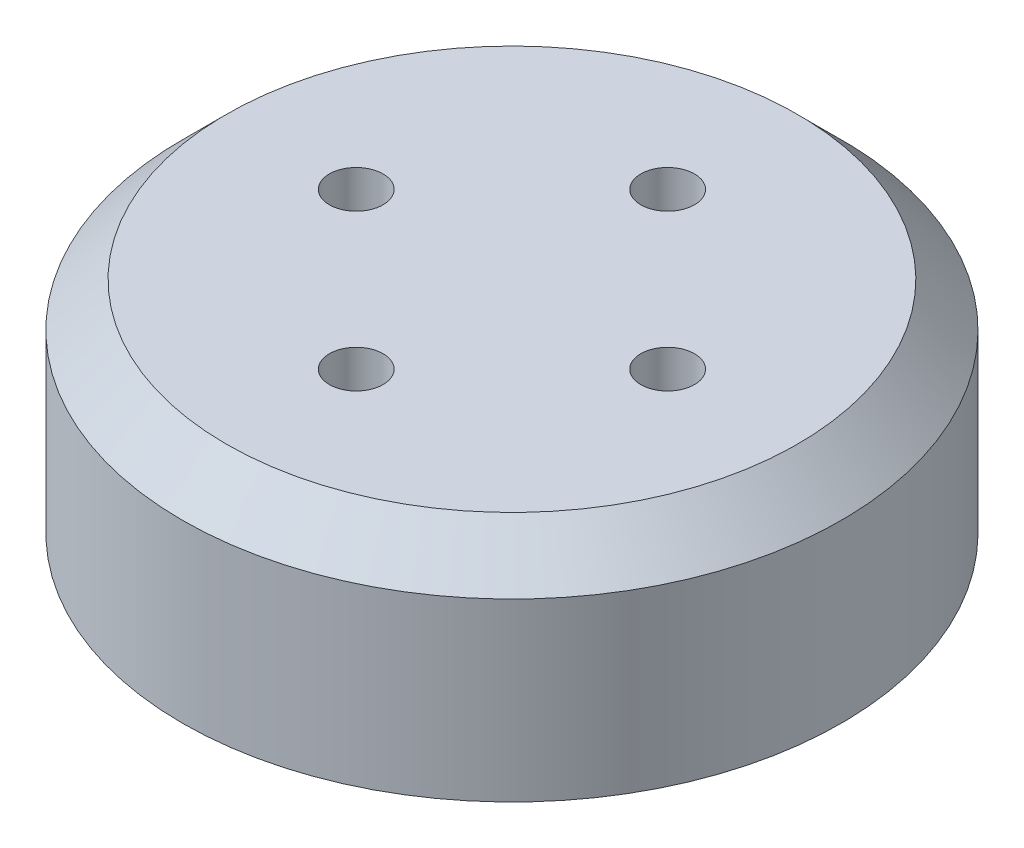
ISO-10303-21;
HEADER;
FILE_DESCRIPTION(('STEP AP214'),'2;1');
FILE_NAME('part.step','',(''),(''),'','','');
FILE_SCHEMA(('AUTOMOTIVE_DESIGN { 1 0 10303 214 1 1 1 1 }'));
ENDSEC;
DATA;
#1=APPLICATION_CONTEXT('core data for automotive mechanical design processes');
#2=APPLICATION_PROTOCOL_DEFINITION('international standard','automotive_design',2000,#1);
#3=PRODUCT_CONTEXT('',#1,'mechanical');
#4=PRODUCT('Part','Part','',(#3));
#5=PRODUCT_RELATED_PRODUCT_CATEGORY('part','',(#4));
#6=PRODUCT_DEFINITION_FORMATION('','',#4);
#7=PRODUCT_DEFINITION_CONTEXT('part definition',#1,'design');
#8=PRODUCT_DEFINITION('design','',#6,#7);
#9=PRODUCT_DEFINITION_SHAPE('','',#8);
#10=(LENGTH_UNIT() NAMED_UNIT(*) SI_UNIT(.MILLI.,.METRE.));
#11=(NAMED_UNIT(*) PLANE_ANGLE_UNIT() SI_UNIT($,.RADIAN.));
#12=(NAMED_UNIT(*) SI_UNIT($,.STERADIAN.) SOLID_ANGLE_UNIT());
#13=UNCERTAINTY_MEASURE_WITH_UNIT(LENGTH_MEASURE(1.E-05),#10,'distance_accuracy_value','');
#14=(GEOMETRIC_REPRESENTATION_CONTEXT(3) GLOBAL_UNCERTAINTY_ASSIGNED_CONTEXT((#13)) GLOBAL_UNIT_ASSIGNED_CONTEXT((#10,
#11,#12)) REPRESENTATION_CONTEXT('',''));
#15=CARTESIAN_POINT('',(0.,0.,0.));
#16=DIRECTION('',(0.,0.,1.));
#17=DIRECTION('',(1.,0.,0.));
#18=AXIS2_PLACEMENT_3D('',#15,#16,#17);
#19=CARTESIAN_POINT('',(0.,12.7,19.05));
#20=DIRECTION('',(0.,1.,0.));
#21=DIRECTION('',(0.,0.,1.));
#22=AXIS2_PLACEMENT_3D('',#19,#20,#21);
#23=PLANE('',#22);
#24=CARTESIAN_POINT('',(0.,12.7,0.));
#25=DIRECTION('',(0.,1.,0.));
#26=DIRECTION('',(0.,0.,1.));
#27=AXIS2_PLACEMENT_3D('',#24,#25,#26);
#28=CIRCLE('',#27,16.51);
#29=CARTESIAN_POINT('',(0.,12.7,16.51));
#30=VERTEX_POINT('',#29);
#31=EDGE_CURVE('E51',#30,#30,#28,.T.);
#32=ORIENTED_EDGE('',*,*,#31,.T.);
#33=EDGE_LOOP('',(#32));
#34=FACE_BOUND('',#33,.T.);
#35=CARTESIAN_POINT('',(0.,12.7,-9.));
#36=DIRECTION('',(0.,1.,0.));
#37=DIRECTION('',(0.,0.,1.));
#38=AXIS2_PLACEMENT_3D('',#35,#36,#37);
#39=CIRCLE('',#38,1.55);
#40=CARTESIAN_POINT('',(0.,12.7,-7.45));
#41=VERTEX_POINT('',#40);
#42=EDGE_CURVE('E74',#41,#41,#39,.T.);
#43=ORIENTED_EDGE('',*,*,#42,.F.);
#44=EDGE_LOOP('',(#43));
#45=FACE_BOUND('',#44,.T.);
#46=CARTESIAN_POINT('',(0.,12.7,9.));
#47=DIRECTION('',(0.,1.,0.));
#48=DIRECTION('',(0.,0.,1.));
#49=AXIS2_PLACEMENT_3D('',#46,#47,#48);
#50=CIRCLE('',#49,1.55);
#51=CARTESIAN_POINT('',(0.,12.7,10.55));
#52=VERTEX_POINT('',#51);
#53=EDGE_CURVE('E87',#52,#52,#50,.T.);
#54=ORIENTED_EDGE('',*,*,#53,.F.);
#55=EDGE_LOOP('',(#54));
#56=FACE_BOUND('',#55,.T.);
#57=CARTESIAN_POINT('',(9.,12.7,0.));
#58=DIRECTION('',(0.,1.,0.));
#59=DIRECTION('',(0.,0.,1.));
#60=AXIS2_PLACEMENT_3D('',#57,#58,#59);
#61=CIRCLE('',#60,1.55);
#62=CARTESIAN_POINT('',(9.,12.7,1.55));
#63=VERTEX_POINT('',#62);
#64=EDGE_CURVE('E83',#63,#63,#61,.T.);
#65=ORIENTED_EDGE('',*,*,#64,.F.);
#66=EDGE_LOOP('',(#65));
#67=FACE_BOUND('',#66,.T.);
#68=CARTESIAN_POINT('',(-9.,12.7,0.));
#69=DIRECTION('',(0.,1.,0.));
#70=DIRECTION('',(0.,0.,1.));
#71=AXIS2_PLACEMENT_3D('',#68,#69,#70);
#72=CIRCLE('',#71,1.55);
#73=CARTESIAN_POINT('',(-9.,12.7,1.55));
#74=VERTEX_POINT('',#73);
#75=EDGE_CURVE('E80',#74,#74,#72,.T.);
#76=ORIENTED_EDGE('',*,*,#75,.F.);
#77=EDGE_LOOP('',(#76));
#78=FACE_BOUND('',#77,.T.);
#79=ADVANCED_FACE('F43',(#34,#45,#56,#67,#78),#23,.T.);
#80=CARTESIAN_POINT('',(0.,-6.35,0.));
#81=DIRECTION('',(0.,-1.,0.));
#82=DIRECTION('',(0.,0.,-1.));
#83=AXIS2_PLACEMENT_3D('',#80,#81,#82);
#84=PLANE('',#83);
#85=CARTESIAN_POINT('',(0.,-6.35,0.));
#86=DIRECTION('',(0.,1.,0.));
#87=DIRECTION('',(0.,0.,1.));
#88=AXIS2_PLACEMENT_3D('',#85,#86,#87);
#89=CIRCLE('',#88,4.975);
#90=CARTESIAN_POINT('',(0.,-6.35,4.975));
#91=VERTEX_POINT('',#90);
#92=EDGE_CURVE('E55',#91,#91,#89,.T.);
#93=ORIENTED_EDGE('',*,*,#92,.F.);
#94=EDGE_LOOP('',(#93));
#95=FACE_BOUND('',#94,.T.);
#96=ADVANCED_FACE('F152',(#95),#84,.T.);
#97=CARTESIAN_POINT('',(0.,12.7,0.));
#98=DIRECTION('',(0.,1.,0.));
#99=DIRECTION('',(0.,0.,1.));
#100=AXIS2_PLACEMENT_3D('',#97,#98,#99);
#101=CYLINDRICAL_SURFACE('',#100,4.975);
#102=ORIENTED_EDGE('',*,*,#92,.T.);
#103=EDGE_LOOP('',(#102));
#104=FACE_BOUND('',#103,.T.);
#105=CARTESIAN_POINT('',(0.,0.,0.));
#106=DIRECTION('',(0.,1.,0.));
#107=DIRECTION('',(0.,0.,1.));
#108=AXIS2_PLACEMENT_3D('',#105,#106,#107);
#109=CIRCLE('',#108,4.975);
#110=CARTESIAN_POINT('',(0.,0.,4.975));
#111=VERTEX_POINT('',#110);
#112=EDGE_CURVE('E59',#111,#111,#109,.T.);
#113=ORIENTED_EDGE('',*,*,#112,.F.);
#114=EDGE_LOOP('',(#113));
#115=FACE_BOUND('',#114,.T.);
#116=ADVANCED_FACE('F122',(#104,#115),#101,.T.);
#117=CARTESIAN_POINT('',(0.,0.,4.975));
#118=DIRECTION('',(0.,-1.,0.));
#119=DIRECTION('',(0.,0.,-1.));
#120=AXIS2_PLACEMENT_3D('',#117,#118,#119);
#121=PLANE('',#120);
#122=CARTESIAN_POINT('',(5.08,0.,-5.08));
#123=DIRECTION('',(0.,-1.,0.));
#124=DIRECTION('',(0.,0.,-1.));
#125=AXIS2_PLACEMENT_3D('',#122,#123,#124);
#126=CIRCLE('',#125,1.45);
#127=CARTESIAN_POINT('',(5.08,0.,-6.53));
#128=VERTEX_POINT('',#127);
#129=EDGE_CURVE('E107',#128,#128,#126,.T.);
#130=ORIENTED_EDGE('',*,*,#129,.F.);
#131=EDGE_LOOP('',(#130));
#132=FACE_BOUND('',#131,.T.);
#133=CARTESIAN_POINT('',(5.08,0.,5.08));
#134=DIRECTION('',(0.,-1.,0.));
#135=DIRECTION('',(0.,0.,-1.));
#136=AXIS2_PLACEMENT_3D('',#133,#134,#135);
#137=CIRCLE('',#136,1.45);
#138=CARTESIAN_POINT('',(5.08,0.,3.63));
#139=VERTEX_POINT('',#138);
#140=EDGE_CURVE('E101',#139,#139,#137,.T.);
#141=ORIENTED_EDGE('',*,*,#140,.F.);
#142=EDGE_LOOP('',(#141));
#143=FACE_BOUND('',#142,.T.);
#144=CARTESIAN_POINT('',(-5.08,0.,5.08));
#145=DIRECTION('',(0.,-1.,0.));
#146=DIRECTION('',(0.,0.,-1.));
#147=AXIS2_PLACEMENT_3D('',#144,#145,#146);
#148=CIRCLE('',#147,1.45);
#149=CARTESIAN_POINT('',(-5.08,0.,3.63));
#150=VERTEX_POINT('',#149);
#151=EDGE_CURVE('E95',#150,#150,#148,.T.);
#152=ORIENTED_EDGE('',*,*,#151,.F.);
#153=EDGE_LOOP('',(#152));
#154=FACE_BOUND('',#153,.T.);
#155=CARTESIAN_POINT('',(-5.08,0.,-5.08));
#156=DIRECTION('',(0.,-1.,0.));
#157=DIRECTION('',(0.,0.,-1.));
#158=AXIS2_PLACEMENT_3D('',#155,#156,#157);
#159=CIRCLE('',#158,1.45);
#160=CARTESIAN_POINT('',(-5.08,0.,-6.53));
#161=VERTEX_POINT('',#160);
#162=EDGE_CURVE('E92',#161,#161,#159,.T.);
#163=ORIENTED_EDGE('',*,*,#162,.F.);
#164=EDGE_LOOP('',(#163));
#165=FACE_BOUND('',#164,.T.);
#166=CARTESIAN_POINT('',(0.,0.,-9.));
#167=DIRECTION('',(0.,-1.,0.));
#168=DIRECTION('',(0.,0.,-1.));
#169=AXIS2_PLACEMENT_3D('',#166,#167,#168);
#170=CIRCLE('',#169,1.55);
#171=CARTESIAN_POINT('',(0.,0.,-10.55));
#172=VERTEX_POINT('',#171);
#173=EDGE_CURVE('E62',#172,#172,#170,.T.);
#174=ORIENTED_EDGE('',*,*,#173,.F.);
#175=EDGE_LOOP('',(#174));
#176=FACE_BOUND('',#175,.T.);
#177=CARTESIAN_POINT('',(0.,0.,9.));
#178=DIRECTION('',(0.,-1.,0.));
#179=DIRECTION('',(0.,0.,-1.));
#180=AXIS2_PLACEMENT_3D('',#177,#178,#179);
#181=CIRCLE('',#180,1.55);
#182=CARTESIAN_POINT('',(0.,0.,7.45));
#183=VERTEX_POINT('',#182);
#184=EDGE_CURVE('E66',#183,#183,#181,.T.);
#185=ORIENTED_EDGE('',*,*,#184,.F.);
#186=EDGE_LOOP('',(#185));
#187=FACE_BOUND('',#186,.T.);
#188=CARTESIAN_POINT('',(9.,0.,0.));
#189=DIRECTION('',(0.,-1.,0.));
#190=DIRECTION('',(0.,0.,-1.));
#191=AXIS2_PLACEMENT_3D('',#188,#189,#190);
#192=CIRCLE('',#191,1.55);
#193=CARTESIAN_POINT('',(9.,0.,-1.55));
#194=VERTEX_POINT('',#193);
#195=EDGE_CURVE('E69',#194,#194,#192,.T.);
#196=ORIENTED_EDGE('',*,*,#195,.F.);
#197=EDGE_LOOP('',(#196));
#198=FACE_BOUND('',#197,.T.);
#199=CARTESIAN_POINT('',(-9.,0.,0.));
#200=DIRECTION('',(0.,-1.,0.));
#201=DIRECTION('',(0.,0.,-1.));
#202=AXIS2_PLACEMENT_3D('',#199,#200,#201);
#203=CIRCLE('',#202,1.55);
#204=CARTESIAN_POINT('',(-9.,0.,-1.55));
#205=VERTEX_POINT('',#204);
#206=EDGE_CURVE('E72',#205,#205,#203,.T.);
#207=ORIENTED_EDGE('',*,*,#206,.F.);
#208=EDGE_LOOP('',(#207));
#209=FACE_BOUND('',#208,.T.);
#210=ORIENTED_EDGE('',*,*,#112,.T.);
#211=EDGE_LOOP('',(#210));
#212=FACE_BOUND('',#211,.T.);
#213=CARTESIAN_POINT('',(0.,0.,0.));
#214=DIRECTION('',(0.,1.,0.));
#215=DIRECTION('',(0.,0.,1.));
#216=AXIS2_PLACEMENT_3D('',#213,#214,#215);
#217=CIRCLE('',#216,19.05);
#218=CARTESIAN_POINT('',(0.,0.,19.05));
#219=VERTEX_POINT('',#218);
#220=EDGE_CURVE('E65',#219,#219,#217,.T.);
#221=ORIENTED_EDGE('',*,*,#220,.F.);
#222=EDGE_LOOP('',(#221));
#223=FACE_BOUND('',#222,.T.);
#224=ADVANCED_FACE('F118',(#132,#143,#154,#165,#176,#187,#198,#209,#212,#223),#121,.T.);
#225=CARTESIAN_POINT('',(0.,12.7,0.));
#226=DIRECTION('',(0.,1.,0.));
#227=DIRECTION('',(0.,0.,1.));
#228=AXIS2_PLACEMENT_3D('',#225,#226,#227);
#229=CYLINDRICAL_SURFACE('',#228,19.05);
#230=CARTESIAN_POINT('',(0.,10.16,0.));
#231=DIRECTION('',(0.,1.,0.));
#232=DIRECTION('',(0.,0.,1.));
#233=AXIS2_PLACEMENT_3D('',#230,#231,#232);
#234=CIRCLE('',#233,19.05);
#235=CARTESIAN_POINT('',(0.,10.16,19.05));
#236=VERTEX_POINT('',#235);
#237=EDGE_CURVE('E10',#236,#236,#234,.F.);
#238=ORIENTED_EDGE('',*,*,#237,.T.);
#239=EDGE_LOOP('',(#238));
#240=FACE_BOUND('',#239,.T.);
#241=ORIENTED_EDGE('',*,*,#220,.T.);
#242=EDGE_LOOP('',(#241));
#243=FACE_BOUND('',#242,.T.);
#244=ADVANCED_FACE('F121',(#240,#243),#229,.T.);
#245=CARTESIAN_POINT('',(-9.,-6.35,0.));
#246=DIRECTION('',(0.,1.,0.));
#247=DIRECTION('',(0.,0.,1.));
#248=AXIS2_PLACEMENT_3D('',#245,#246,#247);
#249=CYLINDRICAL_SURFACE('',#248,1.55);
#250=ORIENTED_EDGE('',*,*,#206,.T.);
#251=EDGE_LOOP('',(#250));
#252=FACE_BOUND('',#251,.T.);
#253=ORIENTED_EDGE('',*,*,#75,.T.);
#254=EDGE_LOOP('',(#253));
#255=FACE_BOUND('',#254,.T.);
#256=ADVANCED_FACE('F143',(#252,#255),#249,.F.);
#257=CARTESIAN_POINT('',(9.,-6.35,0.));
#258=DIRECTION('',(0.,1.,0.));
#259=DIRECTION('',(0.,0.,1.));
#260=AXIS2_PLACEMENT_3D('',#257,#258,#259);
#261=CYLINDRICAL_SURFACE('',#260,1.55);
#262=ORIENTED_EDGE('',*,*,#195,.T.);
#263=EDGE_LOOP('',(#262));
#264=FACE_BOUND('',#263,.T.);
#265=ORIENTED_EDGE('',*,*,#64,.T.);
#266=EDGE_LOOP('',(#265));
#267=FACE_BOUND('',#266,.T.);
#268=ADVANCED_FACE('F148',(#264,#267),#261,.F.);
#269=CARTESIAN_POINT('',(0.,-6.35,9.));
#270=DIRECTION('',(0.,1.,0.));
#271=DIRECTION('',(0.,0.,1.));
#272=AXIS2_PLACEMENT_3D('',#269,#270,#271);
#273=CYLINDRICAL_SURFACE('',#272,1.55);
#274=ORIENTED_EDGE('',*,*,#184,.T.);
#275=EDGE_LOOP('',(#274));
#276=FACE_BOUND('',#275,.T.);
#277=ORIENTED_EDGE('',*,*,#53,.T.);
#278=EDGE_LOOP('',(#277));
#279=FACE_BOUND('',#278,.T.);
#280=ADVANCED_FACE('F195',(#276,#279),#273,.F.);
#281=CARTESIAN_POINT('',(0.,-6.35,-9.));
#282=DIRECTION('',(0.,1.,0.));
#283=DIRECTION('',(0.,0.,1.));
#284=AXIS2_PLACEMENT_3D('',#281,#282,#283);
#285=CYLINDRICAL_SURFACE('',#284,1.55);
#286=ORIENTED_EDGE('',*,*,#173,.T.);
#287=EDGE_LOOP('',(#286));
#288=FACE_BOUND('',#287,.T.);
#289=ORIENTED_EDGE('',*,*,#42,.T.);
#290=EDGE_LOOP('',(#289));
#291=FACE_BOUND('',#290,.T.);
#292=ADVANCED_FACE('F205',(#288,#291),#285,.F.);
#293=CARTESIAN_POINT('',(-5.08,-1.27,-5.08));
#294=DIRECTION('',(0.,1.,0.));
#295=DIRECTION('',(0.,0.,1.));
#296=AXIS2_PLACEMENT_3D('',#293,#294,#295);
#297=CYLINDRICAL_SURFACE('',#296,1.45);
#298=CARTESIAN_POINT('',(-5.08,-1.27,-5.08));
#299=DIRECTION('',(0.,-1.,0.));
#300=DIRECTION('',(0.,0.,-1.));
#301=AXIS2_PLACEMENT_3D('',#298,#299,#300);
#302=CIRCLE('',#301,1.45);
#303=CARTESIAN_POINT('',(-5.08,-1.27,-6.53));
#304=VERTEX_POINT('',#303);
#305=EDGE_CURVE('E84',#304,#304,#302,.T.);
#306=ORIENTED_EDGE('',*,*,#305,.F.);
#307=EDGE_LOOP('',(#306));
#308=FACE_BOUND('',#307,.T.);
#309=ORIENTED_EDGE('',*,*,#162,.T.);
#310=EDGE_LOOP('',(#309));
#311=FACE_BOUND('',#310,.T.);
#312=ADVANCED_FACE('F214',(#308,#311),#297,.T.);
#313=CARTESIAN_POINT('',(-5.08,-1.27,-5.08));
#314=DIRECTION('',(0.,-1.,0.));
#315=DIRECTION('',(0.,0.,-1.));
#316=AXIS2_PLACEMENT_3D('',#313,#314,#315);
#317=PLANE('',#316);
#318=ORIENTED_EDGE('',*,*,#305,.T.);
#319=EDGE_LOOP('',(#318));
#320=FACE_BOUND('',#319,.T.);
#321=ADVANCED_FACE('F223',(#320),#317,.T.);
#322=CARTESIAN_POINT('',(-5.08,-1.27,5.08));
#323=DIRECTION('',(0.,1.,0.));
#324=DIRECTION('',(0.,0.,1.));
#325=AXIS2_PLACEMENT_3D('',#322,#323,#324);
#326=CYLINDRICAL_SURFACE('',#325,1.45);
#327=CARTESIAN_POINT('',(-5.08,-1.27,5.08));
#328=DIRECTION('',(0.,-1.,0.));
#329=DIRECTION('',(0.,0.,-1.));
#330=AXIS2_PLACEMENT_3D('',#327,#328,#329);
#331=CIRCLE('',#330,1.45);
#332=CARTESIAN_POINT('',(-5.08,-1.27,3.63));
#333=VERTEX_POINT('',#332);
#334=EDGE_CURVE('E98',#333,#333,#331,.T.);
#335=ORIENTED_EDGE('',*,*,#334,.F.);
#336=EDGE_LOOP('',(#335));
#337=FACE_BOUND('',#336,.T.);
#338=ORIENTED_EDGE('',*,*,#151,.T.);
#339=EDGE_LOOP('',(#338));
#340=FACE_BOUND('',#339,.T.);
#341=ADVANCED_FACE('F233',(#337,#340),#326,.T.);
#342=CARTESIAN_POINT('',(-5.08,-1.27,5.08));
#343=DIRECTION('',(0.,-1.,0.));
#344=DIRECTION('',(0.,0.,-1.));
#345=AXIS2_PLACEMENT_3D('',#342,#343,#344);
#346=PLANE('',#345);
#347=ORIENTED_EDGE('',*,*,#334,.T.);
#348=EDGE_LOOP('',(#347));
#349=FACE_BOUND('',#348,.T.);
#350=ADVANCED_FACE('F243',(#349),#346,.T.);
#351=CARTESIAN_POINT('',(5.08,-1.27,5.08));
#352=DIRECTION('',(0.,1.,0.));
#353=DIRECTION('',(0.,0.,1.));
#354=AXIS2_PLACEMENT_3D('',#351,#352,#353);
#355=CYLINDRICAL_SURFACE('',#354,1.45);
#356=CARTESIAN_POINT('',(5.08,-1.27,5.08));
#357=DIRECTION('',(0.,-1.,0.));
#358=DIRECTION('',(0.,0.,-1.));
#359=AXIS2_PLACEMENT_3D('',#356,#357,#358);
#360=CIRCLE('',#359,1.45);
#361=CARTESIAN_POINT('',(5.08,-1.27,3.63));
#362=VERTEX_POINT('',#361);
#363=EDGE_CURVE('E104',#362,#362,#360,.T.);
#364=ORIENTED_EDGE('',*,*,#363,.F.);
#365=EDGE_LOOP('',(#364));
#366=FACE_BOUND('',#365,.T.);
#367=ORIENTED_EDGE('',*,*,#140,.T.);
#368=EDGE_LOOP('',(#367));
#369=FACE_BOUND('',#368,.T.);
#370=ADVANCED_FACE('F253',(#366,#369),#355,.T.);
#371=CARTESIAN_POINT('',(5.08,-1.27,5.08));
#372=DIRECTION('',(0.,-1.,0.));
#373=DIRECTION('',(0.,0.,-1.));
#374=AXIS2_PLACEMENT_3D('',#371,#372,#373);
#375=PLANE('',#374);
#376=ORIENTED_EDGE('',*,*,#363,.T.);
#377=EDGE_LOOP('',(#376));
#378=FACE_BOUND('',#377,.T.);
#379=ADVANCED_FACE('F263',(#378),#375,.T.);
#380=CARTESIAN_POINT('',(5.08,-1.27,-5.08));
#381=DIRECTION('',(0.,1.,0.));
#382=DIRECTION('',(0.,0.,1.));
#383=AXIS2_PLACEMENT_3D('',#380,#381,#382);
#384=CYLINDRICAL_SURFACE('',#383,1.45);
#385=CARTESIAN_POINT('',(5.08,-1.27,-5.08));
#386=DIRECTION('',(0.,-1.,0.));
#387=DIRECTION('',(0.,0.,-1.));
#388=AXIS2_PLACEMENT_3D('',#385,#386,#387);
#389=CIRCLE('',#388,1.45);
#390=CARTESIAN_POINT('',(5.08,-1.27,-6.53));
#391=VERTEX_POINT('',#390);
#392=EDGE_CURVE('E110',#391,#391,#389,.T.);
#393=ORIENTED_EDGE('',*,*,#392,.F.);
#394=EDGE_LOOP('',(#393));
#395=FACE_BOUND('',#394,.T.);
#396=ORIENTED_EDGE('',*,*,#129,.T.);
#397=EDGE_LOOP('',(#396));
#398=FACE_BOUND('',#397,.T.);
#399=ADVANCED_FACE('F116',(#395,#398),#384,.T.);
#400=CARTESIAN_POINT('',(5.08,-1.27,-5.08));
#401=DIRECTION('',(0.,-1.,0.));
#402=DIRECTION('',(0.,0.,-1.));
#403=AXIS2_PLACEMENT_3D('',#400,#401,#402);
#404=PLANE('',#403);
#405=ORIENTED_EDGE('',*,*,#392,.T.);
#406=EDGE_LOOP('',(#405));
#407=FACE_BOUND('',#406,.T.);
#408=ADVANCED_FACE('F282',(#407),#404,.T.);
#409=CARTESIAN_POINT('',(0.,12.7,0.));
#410=DIRECTION('',(0.,-1.,0.));
#411=DIRECTION('',(0.,0.,-1.));
#412=AXIS2_PLACEMENT_3D('',#409,#410,#411);
#413=CONICAL_SURFACE('',#412,16.51,0.785398163397447);
#414=ORIENTED_EDGE('',*,*,#237,.F.);
#415=EDGE_LOOP('',(#414));
#416=FACE_BOUND('',#415,.T.);
#417=ORIENTED_EDGE('',*,*,#31,.F.);
#418=EDGE_LOOP('',(#417));
#419=FACE_BOUND('',#418,.T.);
#420=ADVANCED_FACE('F46',(#416,#419),#413,.T.);
#421=CLOSED_SHELL('',(#79,#96,#116,#224,#244,#256,#268,#280,#292,#312,#321,#341,#350,#370,#379,
#399,#408,#420));
#422=MANIFOLD_SOLID_BREP('B2',#421);
#423=ADVANCED_BREP_SHAPE_REPRESENTATION('',(#18,#422),#14);
#424=SHAPE_DEFINITION_REPRESENTATION(#9,#423);
ENDSEC;
END-ISO-10303-21;
